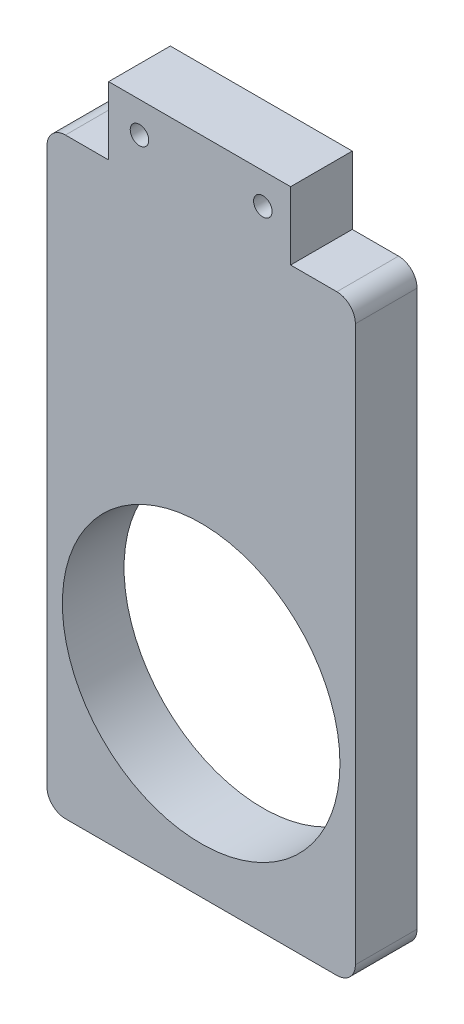
ISO-10303-21;
HEADER;
FILE_DESCRIPTION(('STEP AP214'),'2;1');
FILE_NAME('part.step','',(''),(''),'','','');
FILE_SCHEMA(('AUTOMOTIVE_DESIGN { 1 0 10303 214 1 1 1 1 }'));
ENDSEC;
DATA;
#1=APPLICATION_CONTEXT('core data for automotive mechanical design processes');
#2=APPLICATION_PROTOCOL_DEFINITION('international standard','automotive_design',2000,#1);
#3=PRODUCT_CONTEXT('',#1,'mechanical');
#4=PRODUCT('Part','Part','',(#3));
#5=PRODUCT_RELATED_PRODUCT_CATEGORY('part','',(#4));
#6=PRODUCT_DEFINITION_FORMATION('','',#4);
#7=PRODUCT_DEFINITION_CONTEXT('part definition',#1,'design');
#8=PRODUCT_DEFINITION('design','',#6,#7);
#9=PRODUCT_DEFINITION_SHAPE('','',#8);
#10=(LENGTH_UNIT() NAMED_UNIT(*) SI_UNIT(.MILLI.,.METRE.));
#11=(NAMED_UNIT(*) PLANE_ANGLE_UNIT() SI_UNIT($,.RADIAN.));
#12=(NAMED_UNIT(*) SI_UNIT($,.STERADIAN.) SOLID_ANGLE_UNIT());
#13=UNCERTAINTY_MEASURE_WITH_UNIT(LENGTH_MEASURE(1.E-05),#10,'distance_accuracy_value','');
#14=(GEOMETRIC_REPRESENTATION_CONTEXT(3) GLOBAL_UNCERTAINTY_ASSIGNED_CONTEXT((#13)) GLOBAL_UNIT_ASSIGNED_CONTEXT((#10,
#11,#12)) REPRESENTATION_CONTEXT('',''));
#15=CARTESIAN_POINT('',(0.,0.,0.));
#16=DIRECTION('',(0.,0.,1.));
#17=DIRECTION('',(1.,0.,0.));
#18=AXIS2_PLACEMENT_3D('',#15,#16,#17);
#19=CARTESIAN_POINT('',(2.99999999999999,-35.,0.));
#20=DIRECTION('',(0.,0.,1.));
#21=DIRECTION('',(1.,0.,0.));
#22=AXIS2_PLACEMENT_3D('',#19,#20,#21);
#23=CYLINDRICAL_SURFACE('',#22,2.99999999999998);
#24=CARTESIAN_POINT('',(2.99999999999999,-35.,10.));
#25=DIRECTION('',(0.,0.,1.));
#26=DIRECTION('',(1.,0.,0.));
#27=AXIS2_PLACEMENT_3D('',#24,#25,#26);
#28=CIRCLE('',#27,2.99999999999998);
#29=CARTESIAN_POINT('',(0.,-35.,10.));
#30=VERTEX_POINT('',#29);
#31=CARTESIAN_POINT('',(2.99999999999999,-38.,10.));
#32=VERTEX_POINT('',#31);
#33=EDGE_CURVE('E166',#30,#32,#28,.T.);
#34=ORIENTED_EDGE('',*,*,#33,.F.);
#35=DIRECTION('',(0.,0.,1.));
#36=VECTOR('',#35,1.);
#37=CARTESIAN_POINT('',(0.,-35.,0.));
#38=LINE('',#37,#36);
#39=CARTESIAN_POINT('',(0.,-35.,0.));
#40=VERTEX_POINT('',#39);
#41=EDGE_CURVE('E11',#40,#30,#38,.T.);
#42=ORIENTED_EDGE('',*,*,#41,.F.);
#43=CARTESIAN_POINT('',(2.99999999999999,-35.,0.));
#44=DIRECTION('',(0.,0.,1.));
#45=DIRECTION('',(1.,0.,0.));
#46=AXIS2_PLACEMENT_3D('',#43,#44,#45);
#47=CIRCLE('',#46,2.99999999999998);
#48=CARTESIAN_POINT('',(2.99999999999999,-38.,0.));
#49=VERTEX_POINT('',#48);
#50=EDGE_CURVE('E211',#40,#49,#47,.T.);
#51=ORIENTED_EDGE('',*,*,#50,.T.);
#52=DIRECTION('',(0.,0.,1.));
#53=VECTOR('',#52,1.);
#54=CARTESIAN_POINT('',(2.99999999999999,-38.,0.));
#55=LINE('',#54,#53);
#56=EDGE_CURVE('E42',#49,#32,#55,.T.);
#57=ORIENTED_EDGE('',*,*,#56,.T.);
#58=EDGE_LOOP('',(#34,#42,#51,#57));
#59=FACE_BOUND('',#58,.T.);
#60=ADVANCED_FACE('F39',(#59),#23,.T.);
#61=CARTESIAN_POINT('',(0.,55.,0.));
#62=DIRECTION('',(-1.,0.,0.));
#63=DIRECTION('',(0.,-1.,0.));
#64=AXIS2_PLACEMENT_3D('',#61,#62,#63);
#65=PLANE('',#64);
#66=DIRECTION('',(0.,-1.,0.));
#67=VECTOR('',#66,1.);
#68=CARTESIAN_POINT('',(0.,55.,10.));
#69=LINE('',#68,#67);
#70=CARTESIAN_POINT('',(0.,55.,10.));
#71=VERTEX_POINT('',#70);
#72=EDGE_CURVE('E208',#71,#30,#69,.T.);
#73=ORIENTED_EDGE('',*,*,#72,.F.);
#74=DIRECTION('',(0.,0.,1.));
#75=VECTOR('',#74,1.);
#76=CARTESIAN_POINT('',(0.,55.,0.));
#77=LINE('',#76,#75);
#78=CARTESIAN_POINT('',(0.,55.,0.));
#79=VERTEX_POINT('',#78);
#80=EDGE_CURVE('E49',#79,#71,#77,.T.);
#81=ORIENTED_EDGE('',*,*,#80,.F.);
#82=DIRECTION('',(0.,-1.,0.));
#83=VECTOR('',#82,1.);
#84=CARTESIAN_POINT('',(0.,55.,0.));
#85=LINE('',#84,#83);
#86=EDGE_CURVE('E152',#79,#40,#85,.T.);
#87=ORIENTED_EDGE('',*,*,#86,.T.);
#88=ORIENTED_EDGE('',*,*,#41,.T.);
#89=EDGE_LOOP('',(#73,#81,#87,#88));
#90=FACE_BOUND('',#89,.T.);
#91=ADVANCED_FACE('F241',(#90),#65,.T.);
#92=CARTESIAN_POINT('',(2.99999999999999,55.,0.));
#93=DIRECTION('',(0.,0.,1.));
#94=DIRECTION('',(1.,0.,0.));
#95=AXIS2_PLACEMENT_3D('',#92,#93,#94);
#96=CYLINDRICAL_SURFACE('',#95,3.);
#97=CARTESIAN_POINT('',(2.99999999999999,55.,10.));
#98=DIRECTION('',(0.,0.,1.));
#99=DIRECTION('',(1.,0.,0.));
#100=AXIS2_PLACEMENT_3D('',#97,#98,#99);
#101=CIRCLE('',#100,3.);
#102=CARTESIAN_POINT('',(2.99999999999999,58.,10.));
#103=VERTEX_POINT('',#102);
#104=EDGE_CURVE('E138',#103,#71,#101,.T.);
#105=ORIENTED_EDGE('',*,*,#104,.F.);
#106=DIRECTION('',(0.,0.,1.));
#107=VECTOR('',#106,1.);
#108=CARTESIAN_POINT('',(2.99999999999999,58.,0.));
#109=LINE('',#108,#107);
#110=CARTESIAN_POINT('',(2.99999999999999,58.,0.));
#111=VERTEX_POINT('',#110);
#112=EDGE_CURVE('E133',#111,#103,#109,.T.);
#113=ORIENTED_EDGE('',*,*,#112,.F.);
#114=CARTESIAN_POINT('',(2.99999999999999,55.,0.));
#115=DIRECTION('',(0.,0.,1.));
#116=DIRECTION('',(1.,0.,0.));
#117=AXIS2_PLACEMENT_3D('',#114,#115,#116);
#118=CIRCLE('',#117,3.);
#119=EDGE_CURVE('E136',#111,#79,#118,.T.);
#120=ORIENTED_EDGE('',*,*,#119,.T.);
#121=ORIENTED_EDGE('',*,*,#80,.T.);
#122=EDGE_LOOP('',(#105,#113,#120,#121));
#123=FACE_BOUND('',#122,.T.);
#124=ADVANCED_FACE('F135',(#123),#96,.T.);
#125=CARTESIAN_POINT('',(10.,58.,0.));
#126=DIRECTION('',(0.,1.,0.));
#127=DIRECTION('',(0.,0.,1.));
#128=AXIS2_PLACEMENT_3D('',#125,#126,#127);
#129=PLANE('',#128);
#130=DIRECTION('',(-1.,0.,0.));
#131=VECTOR('',#130,1.);
#132=CARTESIAN_POINT('',(10.,58.,10.));
#133=LINE('',#132,#131);
#134=CARTESIAN_POINT('',(10.,58.,10.));
#135=VERTEX_POINT('',#134);
#136=EDGE_CURVE('E203',#135,#103,#133,.T.);
#137=ORIENTED_EDGE('',*,*,#136,.F.);
#138=DIRECTION('',(0.,0.,1.));
#139=VECTOR('',#138,1.);
#140=CARTESIAN_POINT('',(10.,58.,0.));
#141=LINE('',#140,#139);
#142=CARTESIAN_POINT('',(10.,58.,0.));
#143=VERTEX_POINT('',#142);
#144=EDGE_CURVE('E144',#143,#135,#141,.T.);
#145=ORIENTED_EDGE('',*,*,#144,.F.);
#146=DIRECTION('',(-1.,0.,0.));
#147=VECTOR('',#146,1.);
#148=CARTESIAN_POINT('',(10.,58.,0.));
#149=LINE('',#148,#147);
#150=EDGE_CURVE('E150',#143,#111,#149,.T.);
#151=ORIENTED_EDGE('',*,*,#150,.T.);
#152=ORIENTED_EDGE('',*,*,#112,.T.);
#153=EDGE_LOOP('',(#137,#145,#151,#152));
#154=FACE_BOUND('',#153,.T.);
#155=ADVANCED_FACE('F155',(#154),#129,.T.);
#156=CARTESIAN_POINT('',(9.99999999999999,69.,0.));
#157=DIRECTION('',(-1.,0.,0.));
#158=DIRECTION('',(0.,-1.,0.));
#159=AXIS2_PLACEMENT_3D('',#156,#157,#158);
#160=PLANE('',#159);
#161=DIRECTION('',(0.,-1.,0.));
#162=VECTOR('',#161,1.);
#163=CARTESIAN_POINT('',(9.99999999999999,69.,10.));
#164=LINE('',#163,#162);
#165=CARTESIAN_POINT('',(9.99999999999999,69.,10.));
#166=VERTEX_POINT('',#165);
#167=EDGE_CURVE('E199',#166,#135,#164,.T.);
#168=ORIENTED_EDGE('',*,*,#167,.F.);
#169=DIRECTION('',(0.,0.,1.));
#170=VECTOR('',#169,1.);
#171=CARTESIAN_POINT('',(9.99999999999999,69.,0.));
#172=LINE('',#171,#170);
#173=CARTESIAN_POINT('',(9.99999999999999,69.,0.));
#174=VERTEX_POINT('',#173);
#175=EDGE_CURVE('E217',#174,#166,#172,.T.);
#176=ORIENTED_EDGE('',*,*,#175,.F.);
#177=DIRECTION('',(0.,-1.,0.));
#178=VECTOR('',#177,1.);
#179=CARTESIAN_POINT('',(9.99999999999999,69.,0.));
#180=LINE('',#179,#178);
#181=EDGE_CURVE('E157',#174,#143,#180,.T.);
#182=ORIENTED_EDGE('',*,*,#181,.T.);
#183=ORIENTED_EDGE('',*,*,#144,.T.);
#184=EDGE_LOOP('',(#168,#176,#182,#183));
#185=FACE_BOUND('',#184,.T.);
#186=ADVANCED_FACE('F254',(#185),#160,.T.);
#187=CARTESIAN_POINT('',(39.5,69.,0.));
#188=DIRECTION('',(0.,1.,0.));
#189=DIRECTION('',(0.,0.,1.));
#190=AXIS2_PLACEMENT_3D('',#187,#188,#189);
#191=PLANE('',#190);
#192=DIRECTION('',(-1.,0.,0.));
#193=VECTOR('',#192,1.);
#194=CARTESIAN_POINT('',(39.5,69.,10.));
#195=LINE('',#194,#193);
#196=CARTESIAN_POINT('',(39.5,69.,10.));
#197=VERTEX_POINT('',#196);
#198=EDGE_CURVE('E195',#197,#166,#195,.T.);
#199=ORIENTED_EDGE('',*,*,#198,.F.);
#200=DIRECTION('',(0.,0.,1.));
#201=VECTOR('',#200,1.);
#202=CARTESIAN_POINT('',(39.5,69.,0.));
#203=LINE('',#202,#201);
#204=CARTESIAN_POINT('',(39.5,69.,0.));
#205=VERTEX_POINT('',#204);
#206=EDGE_CURVE('E220',#205,#197,#203,.T.);
#207=ORIENTED_EDGE('',*,*,#206,.F.);
#208=DIRECTION('',(-1.,0.,0.));
#209=VECTOR('',#208,1.);
#210=CARTESIAN_POINT('',(39.5,69.,0.));
#211=LINE('',#210,#209);
#212=EDGE_CURVE('E160',#205,#174,#211,.T.);
#213=ORIENTED_EDGE('',*,*,#212,.T.);
#214=ORIENTED_EDGE('',*,*,#175,.T.);
#215=EDGE_LOOP('',(#199,#207,#213,#214));
#216=FACE_BOUND('',#215,.T.);
#217=ADVANCED_FACE('F257',(#216),#191,.T.);
#218=CARTESIAN_POINT('',(39.5,58.,0.));
#219=DIRECTION('',(1.,0.,0.));
#220=DIRECTION('',(0.,0.,-1.));
#221=AXIS2_PLACEMENT_3D('',#218,#219,#220);
#222=PLANE('',#221);
#223=DIRECTION('',(0.,1.,0.));
#224=VECTOR('',#223,1.);
#225=CARTESIAN_POINT('',(39.5,58.,10.));
#226=LINE('',#225,#224);
#227=CARTESIAN_POINT('',(39.5,58.,10.));
#228=VERTEX_POINT('',#227);
#229=EDGE_CURVE('E191',#228,#197,#226,.T.);
#230=ORIENTED_EDGE('',*,*,#229,.F.);
#231=DIRECTION('',(0.,0.,1.));
#232=VECTOR('',#231,1.);
#233=CARTESIAN_POINT('',(39.5,58.,0.));
#234=LINE('',#233,#232);
#235=CARTESIAN_POINT('',(39.5,58.,0.));
#236=VERTEX_POINT('',#235);
#237=EDGE_CURVE('E223',#236,#228,#234,.T.);
#238=ORIENTED_EDGE('',*,*,#237,.F.);
#239=DIRECTION('',(0.,1.,0.));
#240=VECTOR('',#239,1.);
#241=CARTESIAN_POINT('',(39.5,58.,0.));
#242=LINE('',#241,#240);
#243=EDGE_CURVE('E353',#236,#205,#242,.T.);
#244=ORIENTED_EDGE('',*,*,#243,.T.);
#245=ORIENTED_EDGE('',*,*,#206,.T.);
#246=EDGE_LOOP('',(#230,#238,#244,#245));
#247=FACE_BOUND('',#246,.T.);
#248=ADVANCED_FACE('F261',(#247),#222,.T.);
#249=CARTESIAN_POINT('',(47.,58.,0.));
#250=DIRECTION('',(0.,1.,0.));
#251=DIRECTION('',(-1.,0.,0.));
#252=AXIS2_PLACEMENT_3D('',#249,#250,#251);
#253=PLANE('',#252);
#254=DIRECTION('',(-1.,0.,0.));
#255=VECTOR('',#254,1.);
#256=CARTESIAN_POINT('',(47.,58.,10.));
#257=LINE('',#256,#255);
#258=CARTESIAN_POINT('',(47.,58.,10.));
#259=VERTEX_POINT('',#258);
#260=EDGE_CURVE('E187',#259,#228,#257,.T.);
#261=ORIENTED_EDGE('',*,*,#260,.F.);
#262=DIRECTION('',(0.,0.,1.));
#263=VECTOR('',#262,1.);
#264=CARTESIAN_POINT('',(47.,58.,0.));
#265=LINE('',#264,#263);
#266=CARTESIAN_POINT('',(47.,58.,0.));
#267=VERTEX_POINT('',#266);
#268=EDGE_CURVE('E226',#267,#259,#265,.T.);
#269=ORIENTED_EDGE('',*,*,#268,.F.);
#270=DIRECTION('',(-1.,0.,0.));
#271=VECTOR('',#270,1.);
#272=CARTESIAN_POINT('',(47.,58.,0.));
#273=LINE('',#272,#271);
#274=EDGE_CURVE('E349',#267,#236,#273,.T.);
#275=ORIENTED_EDGE('',*,*,#274,.T.);
#276=ORIENTED_EDGE('',*,*,#237,.T.);
#277=EDGE_LOOP('',(#261,#269,#275,#276));
#278=FACE_BOUND('',#277,.T.);
#279=ADVANCED_FACE('F265',(#278),#253,.T.);
#280=CARTESIAN_POINT('',(47.,55.,0.));
#281=DIRECTION('',(0.,0.,1.));
#282=DIRECTION('',(1.,0.,0.));
#283=AXIS2_PLACEMENT_3D('',#280,#281,#282);
#284=CYLINDRICAL_SURFACE('',#283,2.99999999999999);
#285=CARTESIAN_POINT('',(47.,55.,10.));
#286=DIRECTION('',(0.,0.,1.));
#287=DIRECTION('',(1.,0.,0.));
#288=AXIS2_PLACEMENT_3D('',#285,#286,#287);
#289=CIRCLE('',#288,2.99999999999999);
#290=CARTESIAN_POINT('',(50.,55.,10.));
#291=VERTEX_POINT('',#290);
#292=EDGE_CURVE('E183',#291,#259,#289,.T.);
#293=ORIENTED_EDGE('',*,*,#292,.F.);
#294=DIRECTION('',(0.,0.,1.));
#295=VECTOR('',#294,1.);
#296=CARTESIAN_POINT('',(50.,55.,0.));
#297=LINE('',#296,#295);
#298=CARTESIAN_POINT('',(50.,55.,0.));
#299=VERTEX_POINT('',#298);
#300=EDGE_CURVE('E229',#299,#291,#297,.T.);
#301=ORIENTED_EDGE('',*,*,#300,.F.);
#302=CARTESIAN_POINT('',(47.,55.,0.));
#303=DIRECTION('',(0.,0.,1.));
#304=DIRECTION('',(1.,0.,0.));
#305=AXIS2_PLACEMENT_3D('',#302,#303,#304);
#306=CIRCLE('',#305,2.99999999999999);
#307=EDGE_CURVE('E345',#299,#267,#306,.T.);
#308=ORIENTED_EDGE('',*,*,#307,.T.);
#309=ORIENTED_EDGE('',*,*,#268,.T.);
#310=EDGE_LOOP('',(#293,#301,#308,#309));
#311=FACE_BOUND('',#310,.T.);
#312=ADVANCED_FACE('F269',(#311),#284,.T.);
#313=CARTESIAN_POINT('',(50.,-35.,0.));
#314=DIRECTION('',(1.,0.,0.));
#315=DIRECTION('',(0.,1.,0.));
#316=AXIS2_PLACEMENT_3D('',#313,#314,#315);
#317=PLANE('',#316);
#318=DIRECTION('',(0.,1.,0.));
#319=VECTOR('',#318,1.);
#320=CARTESIAN_POINT('',(50.,-35.,10.));
#321=LINE('',#320,#319);
#322=CARTESIAN_POINT('',(50.,-35.,10.));
#323=VERTEX_POINT('',#322);
#324=EDGE_CURVE('E179',#323,#291,#321,.T.);
#325=ORIENTED_EDGE('',*,*,#324,.F.);
#326=DIRECTION('',(0.,0.,1.));
#327=VECTOR('',#326,1.);
#328=CARTESIAN_POINT('',(50.,-35.,0.));
#329=LINE('',#328,#327);
#330=CARTESIAN_POINT('',(50.,-35.,0.));
#331=VERTEX_POINT('',#330);
#332=EDGE_CURVE('E232',#331,#323,#329,.T.);
#333=ORIENTED_EDGE('',*,*,#332,.F.);
#334=DIRECTION('',(0.,1.,0.));
#335=VECTOR('',#334,1.);
#336=CARTESIAN_POINT('',(50.,-35.,0.));
#337=LINE('',#336,#335);
#338=EDGE_CURVE('E341',#331,#299,#337,.T.);
#339=ORIENTED_EDGE('',*,*,#338,.T.);
#340=ORIENTED_EDGE('',*,*,#300,.T.);
#341=EDGE_LOOP('',(#325,#333,#339,#340));
#342=FACE_BOUND('',#341,.T.);
#343=ADVANCED_FACE('F273',(#342),#317,.T.);
#344=CARTESIAN_POINT('',(47.,-35.,0.));
#345=DIRECTION('',(0.,0.,1.));
#346=DIRECTION('',(1.,0.,0.));
#347=AXIS2_PLACEMENT_3D('',#344,#345,#346);
#348=CYLINDRICAL_SURFACE('',#347,3.);
#349=CARTESIAN_POINT('',(47.,-35.,10.));
#350=DIRECTION('',(0.,0.,1.));
#351=DIRECTION('',(1.,0.,0.));
#352=AXIS2_PLACEMENT_3D('',#349,#350,#351);
#353=CIRCLE('',#352,3.);
#354=CARTESIAN_POINT('',(47.,-38.,10.));
#355=VERTEX_POINT('',#354);
#356=EDGE_CURVE('E175',#355,#323,#353,.T.);
#357=ORIENTED_EDGE('',*,*,#356,.F.);
#358=DIRECTION('',(0.,0.,1.));
#359=VECTOR('',#358,1.);
#360=CARTESIAN_POINT('',(47.,-38.,0.));
#361=LINE('',#360,#359);
#362=CARTESIAN_POINT('',(47.,-38.,0.));
#363=VERTEX_POINT('',#362);
#364=EDGE_CURVE('E234',#363,#355,#361,.T.);
#365=ORIENTED_EDGE('',*,*,#364,.F.);
#366=CARTESIAN_POINT('',(47.,-35.,0.));
#367=DIRECTION('',(0.,0.,1.));
#368=DIRECTION('',(1.,0.,0.));
#369=AXIS2_PLACEMENT_3D('',#366,#367,#368);
#370=CIRCLE('',#369,3.);
#371=EDGE_CURVE('E337',#363,#331,#370,.T.);
#372=ORIENTED_EDGE('',*,*,#371,.T.);
#373=ORIENTED_EDGE('',*,*,#332,.T.);
#374=EDGE_LOOP('',(#357,#365,#372,#373));
#375=FACE_BOUND('',#374,.T.);
#376=ADVANCED_FACE('F277',(#375),#348,.T.);
#377=CARTESIAN_POINT('',(2.99999999999999,-38.,0.));
#378=DIRECTION('',(0.,-1.,0.));
#379=DIRECTION('',(1.,0.,0.));
#380=AXIS2_PLACEMENT_3D('',#377,#378,#379);
#381=PLANE('',#380);
#382=DIRECTION('',(1.,0.,0.));
#383=VECTOR('',#382,1.);
#384=CARTESIAN_POINT('',(2.99999999999999,-38.,10.));
#385=LINE('',#384,#383);
#386=EDGE_CURVE('E170',#32,#355,#385,.T.);
#387=ORIENTED_EDGE('',*,*,#386,.F.);
#388=ORIENTED_EDGE('',*,*,#56,.F.);
#389=DIRECTION('',(1.,0.,0.));
#390=VECTOR('',#389,1.);
#391=CARTESIAN_POINT('',(2.99999999999999,-38.,0.));
#392=LINE('',#391,#390);
#393=EDGE_CURVE('E334',#49,#363,#392,.T.);
#394=ORIENTED_EDGE('',*,*,#393,.T.);
#395=ORIENTED_EDGE('',*,*,#364,.T.);
#396=EDGE_LOOP('',(#387,#388,#394,#395));
#397=FACE_BOUND('',#396,.T.);
#398=ADVANCED_FACE('F238',(#397),#381,.T.);
#399=CARTESIAN_POINT('',(2.99999999999999,-35.,0.));
#400=DIRECTION('',(0.,0.,1.));
#401=DIRECTION('',(1.,0.,0.));
#402=AXIS2_PLACEMENT_3D('',#399,#400,#401);
#403=PLANE('',#402);
#404=CARTESIAN_POINT('',(35.,64.,0.));
#405=DIRECTION('',(0.,0.,1.));
#406=DIRECTION('',(-1.,0.,0.));
#407=AXIS2_PLACEMENT_3D('',#404,#405,#406);
#408=CIRCLE('',#407,1.5);
#409=CARTESIAN_POINT('',(33.5,64.,0.));
#410=VERTEX_POINT('',#409);
#411=EDGE_CURVE('E308',#410,#410,#408,.T.);
#412=ORIENTED_EDGE('',*,*,#411,.T.);
#413=EDGE_LOOP('',(#412));
#414=FACE_BOUND('',#413,.T.);
#415=CARTESIAN_POINT('',(25.,-7.99999999999999,0.));
#416=DIRECTION('',(0.,0.,1.));
#417=DIRECTION('',(1.,0.,0.));
#418=AXIS2_PLACEMENT_3D('',#415,#416,#417);
#419=CIRCLE('',#418,22.5);
#420=CARTESIAN_POINT('',(47.5,-7.99999999999999,0.));
#421=VERTEX_POINT('',#420);
#422=EDGE_CURVE('E318',#421,#421,#419,.T.);
#423=ORIENTED_EDGE('',*,*,#422,.T.);
#424=EDGE_LOOP('',(#423));
#425=FACE_BOUND('',#424,.T.);
#426=CARTESIAN_POINT('',(15.,64.,0.));
#427=DIRECTION('',(0.,0.,1.));
#428=DIRECTION('',(-1.,0.,0.));
#429=AXIS2_PLACEMENT_3D('',#426,#427,#428);
#430=CIRCLE('',#429,1.5);
#431=CARTESIAN_POINT('',(13.5,64.,0.));
#432=VERTEX_POINT('',#431);
#433=EDGE_CURVE('E171',#432,#432,#430,.T.);
#434=ORIENTED_EDGE('',*,*,#433,.T.);
#435=EDGE_LOOP('',(#434));
#436=FACE_BOUND('',#435,.T.);
#437=ORIENTED_EDGE('',*,*,#50,.F.);
#438=ORIENTED_EDGE('',*,*,#86,.F.);
#439=ORIENTED_EDGE('',*,*,#119,.F.);
#440=ORIENTED_EDGE('',*,*,#150,.F.);
#441=ORIENTED_EDGE('',*,*,#181,.F.);
#442=ORIENTED_EDGE('',*,*,#212,.F.);
#443=ORIENTED_EDGE('',*,*,#243,.F.);
#444=ORIENTED_EDGE('',*,*,#274,.F.);
#445=ORIENTED_EDGE('',*,*,#307,.F.);
#446=ORIENTED_EDGE('',*,*,#338,.F.);
#447=ORIENTED_EDGE('',*,*,#371,.F.);
#448=ORIENTED_EDGE('',*,*,#393,.F.);
#449=EDGE_LOOP('',(#437,#438,#439,#440,#441,#442,#443,#444,#445,#446,#447,#448));
#450=FACE_BOUND('',#449,.T.);
#451=ADVANCED_FACE('F148',(#414,#425,#436,#450),#403,.F.);
#452=CARTESIAN_POINT('',(2.99999999999999,-35.,10.));
#453=DIRECTION('',(0.,0.,1.));
#454=DIRECTION('',(1.,0.,0.));
#455=AXIS2_PLACEMENT_3D('',#452,#453,#454);
#456=PLANE('',#455);
#457=CARTESIAN_POINT('',(35.,64.,10.));
#458=DIRECTION('',(0.,0.,1.));
#459=DIRECTION('',(-1.,0.,0.));
#460=AXIS2_PLACEMENT_3D('',#457,#458,#459);
#461=CIRCLE('',#460,1.5);
#462=CARTESIAN_POINT('',(33.5,64.,10.));
#463=VERTEX_POINT('',#462);
#464=EDGE_CURVE('E311',#463,#463,#461,.T.);
#465=ORIENTED_EDGE('',*,*,#464,.F.);
#466=EDGE_LOOP('',(#465));
#467=FACE_BOUND('',#466,.T.);
#468=CARTESIAN_POINT('',(25.,-7.99999999999999,10.));
#469=DIRECTION('',(0.,0.,1.));
#470=DIRECTION('',(1.,0.,0.));
#471=AXIS2_PLACEMENT_3D('',#468,#469,#470);
#472=CIRCLE('',#471,22.5);
#473=CARTESIAN_POINT('',(47.5,-7.99999999999999,10.));
#474=VERTEX_POINT('',#473);
#475=EDGE_CURVE('E315',#474,#474,#472,.T.);
#476=ORIENTED_EDGE('',*,*,#475,.F.);
#477=EDGE_LOOP('',(#476));
#478=FACE_BOUND('',#477,.T.);
#479=CARTESIAN_POINT('',(15.,64.,10.));
#480=DIRECTION('',(0.,0.,1.));
#481=DIRECTION('',(-1.,0.,0.));
#482=AXIS2_PLACEMENT_3D('',#479,#480,#481);
#483=CIRCLE('',#482,1.5);
#484=CARTESIAN_POINT('',(13.5,64.,10.));
#485=VERTEX_POINT('',#484);
#486=EDGE_CURVE('E322',#485,#485,#483,.T.);
#487=ORIENTED_EDGE('',*,*,#486,.F.);
#488=EDGE_LOOP('',(#487));
#489=FACE_BOUND('',#488,.T.);
#490=ORIENTED_EDGE('',*,*,#33,.T.);
#491=ORIENTED_EDGE('',*,*,#386,.T.);
#492=ORIENTED_EDGE('',*,*,#356,.T.);
#493=ORIENTED_EDGE('',*,*,#324,.T.);
#494=ORIENTED_EDGE('',*,*,#292,.T.);
#495=ORIENTED_EDGE('',*,*,#260,.T.);
#496=ORIENTED_EDGE('',*,*,#229,.T.);
#497=ORIENTED_EDGE('',*,*,#198,.T.);
#498=ORIENTED_EDGE('',*,*,#167,.T.);
#499=ORIENTED_EDGE('',*,*,#136,.T.);
#500=ORIENTED_EDGE('',*,*,#104,.T.);
#501=ORIENTED_EDGE('',*,*,#72,.T.);
#502=EDGE_LOOP('',(#490,#491,#492,#493,#494,#495,#496,#497,#498,#499,#500,#501));
#503=FACE_BOUND('',#502,.T.);
#504=ADVANCED_FACE('F240',(#467,#478,#489,#503),#456,.T.);
#505=CARTESIAN_POINT('',(15.,64.,0.));
#506=DIRECTION('',(0.,0.,1.));
#507=DIRECTION('',(1.,0.,0.));
#508=AXIS2_PLACEMENT_3D('',#505,#506,#507);
#509=CYLINDRICAL_SURFACE('',#508,1.5);
#510=ORIENTED_EDGE('',*,*,#433,.F.);
#511=EDGE_LOOP('',(#510));
#512=FACE_BOUND('',#511,.T.);
#513=ORIENTED_EDGE('',*,*,#486,.T.);
#514=EDGE_LOOP('',(#513));
#515=FACE_BOUND('',#514,.T.);
#516=ADVANCED_FACE('F289',(#512,#515),#509,.F.);
#517=CARTESIAN_POINT('',(25.,-7.99999999999999,0.));
#518=DIRECTION('',(0.,0.,1.));
#519=DIRECTION('',(1.,0.,0.));
#520=AXIS2_PLACEMENT_3D('',#517,#518,#519);
#521=CYLINDRICAL_SURFACE('',#520,22.5);
#522=ORIENTED_EDGE('',*,*,#422,.F.);
#523=EDGE_LOOP('',(#522));
#524=FACE_BOUND('',#523,.T.);
#525=ORIENTED_EDGE('',*,*,#475,.T.);
#526=EDGE_LOOP('',(#525));
#527=FACE_BOUND('',#526,.T.);
#528=ADVANCED_FACE('F296',(#524,#527),#521,.F.);
#529=CARTESIAN_POINT('',(35.,64.,0.));
#530=DIRECTION('',(0.,0.,1.));
#531=DIRECTION('',(1.,0.,0.));
#532=AXIS2_PLACEMENT_3D('',#529,#530,#531);
#533=CYLINDRICAL_SURFACE('',#532,1.5);
#534=ORIENTED_EDGE('',*,*,#411,.F.);
#535=EDGE_LOOP('',(#534));
#536=FACE_BOUND('',#535,.T.);
#537=ORIENTED_EDGE('',*,*,#464,.T.);
#538=EDGE_LOOP('',(#537));
#539=FACE_BOUND('',#538,.T.);
#540=ADVANCED_FACE('F300',(#536,#539),#533,.F.);
#541=CLOSED_SHELL('',(#60,#91,#124,#155,#186,#217,#248,#279,#312,#343,#376,#398,#451,#504,#516,
#528,#540));
#542=MANIFOLD_SOLID_BREP('B2',#541);
#543=ADVANCED_BREP_SHAPE_REPRESENTATION('',(#18,#542),#14);
#544=SHAPE_DEFINITION_REPRESENTATION(#9,#543);
ENDSEC;
END-ISO-10303-21;
